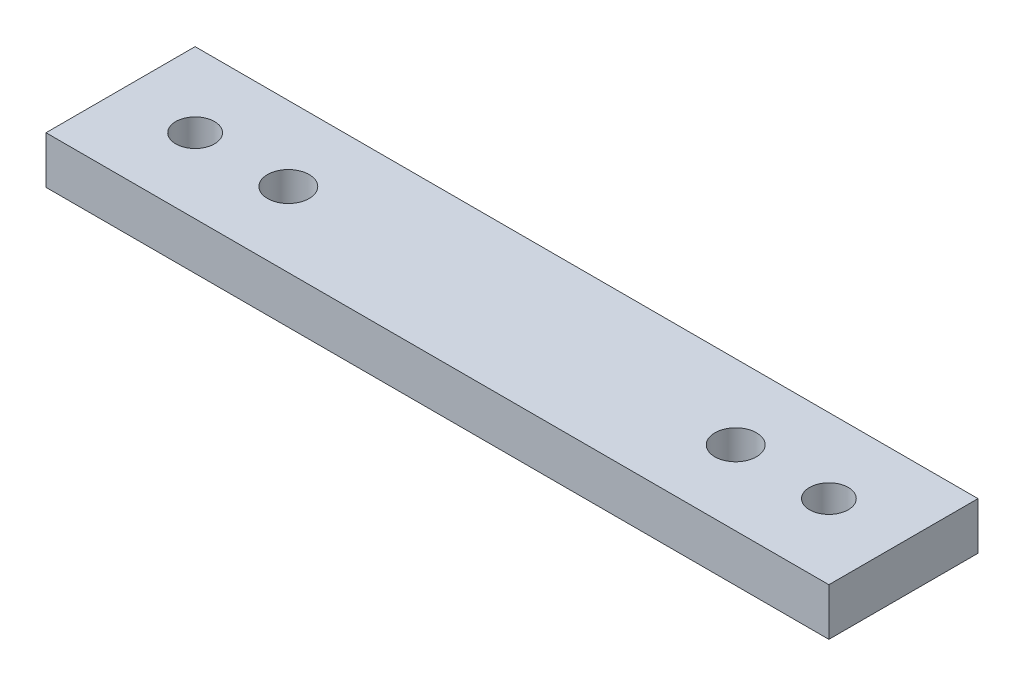
ISO-10303-21;
HEADER;
FILE_DESCRIPTION(('STEP AP214'),'2;1');
FILE_NAME('part.step','',(''),(''),'','','');
FILE_SCHEMA(('AUTOMOTIVE_DESIGN { 1 0 10303 214 1 1 1 1 }'));
ENDSEC;
DATA;
#1=APPLICATION_CONTEXT('core data for automotive mechanical design processes');
#2=APPLICATION_PROTOCOL_DEFINITION('international standard','automotive_design',2000,#1);
#3=PRODUCT_CONTEXT('',#1,'mechanical');
#4=PRODUCT('Part','Part','',(#3));
#5=PRODUCT_RELATED_PRODUCT_CATEGORY('part','',(#4));
#6=PRODUCT_DEFINITION_FORMATION('','',#4);
#7=PRODUCT_DEFINITION_CONTEXT('part definition',#1,'design');
#8=PRODUCT_DEFINITION('design','',#6,#7);
#9=PRODUCT_DEFINITION_SHAPE('','',#8);
#10=(LENGTH_UNIT() NAMED_UNIT(*) SI_UNIT(.MILLI.,.METRE.));
#11=(NAMED_UNIT(*) PLANE_ANGLE_UNIT() SI_UNIT($,.RADIAN.));
#12=(NAMED_UNIT(*) SI_UNIT($,.STERADIAN.) SOLID_ANGLE_UNIT());
#13=UNCERTAINTY_MEASURE_WITH_UNIT(LENGTH_MEASURE(1.E-05),#10,'distance_accuracy_value','');
#14=(GEOMETRIC_REPRESENTATION_CONTEXT(3) GLOBAL_UNCERTAINTY_ASSIGNED_CONTEXT((#13)) GLOBAL_UNIT_ASSIGNED_CONTEXT((#10,
#11,#12)) REPRESENTATION_CONTEXT('',''));
#15=CARTESIAN_POINT('',(0.,0.,0.));
#16=DIRECTION('',(0.,0.,1.));
#17=DIRECTION('',(1.,0.,0.));
#18=AXIS2_PLACEMENT_3D('',#15,#16,#17);
#19=CARTESIAN_POINT('',(52.5,-3.175,-10.));
#20=DIRECTION('',(1.,0.,0.));
#21=DIRECTION('',(0.,0.,-1.));
#22=AXIS2_PLACEMENT_3D('',#19,#20,#21);
#23=PLANE('',#22);
#24=DIRECTION('',(0.,1.,0.));
#25=VECTOR('',#24,1.);
#26=CARTESIAN_POINT('',(52.5,-3.175,-10.));
#27=LINE('',#26,#25);
#28=CARTESIAN_POINT('',(52.5,-3.175,-10.));
#29=VERTEX_POINT('',#28);
#30=CARTESIAN_POINT('',(52.5,3.175,-10.));
#31=VERTEX_POINT('',#30);
#32=EDGE_CURVE('E35',#29,#31,#27,.T.);
#33=ORIENTED_EDGE('',*,*,#32,.T.);
#34=DIRECTION('',(0.,0.,-1.));
#35=VECTOR('',#34,1.);
#36=CARTESIAN_POINT('',(52.5,3.175,-10.));
#37=LINE('',#36,#35);
#38=CARTESIAN_POINT('',(52.5,3.175,10.));
#39=VERTEX_POINT('',#38);
#40=EDGE_CURVE('E72',#39,#31,#37,.T.);
#41=ORIENTED_EDGE('',*,*,#40,.F.);
#42=DIRECTION('',(0.,1.,0.));
#43=VECTOR('',#42,1.);
#44=CARTESIAN_POINT('',(52.5,-3.175,10.));
#45=LINE('',#44,#43);
#46=CARTESIAN_POINT('',(52.5,-3.175,10.));
#47=VERTEX_POINT('',#46);
#48=EDGE_CURVE('E11',#47,#39,#45,.T.);
#49=ORIENTED_EDGE('',*,*,#48,.F.);
#50=DIRECTION('',(0.,0.,-1.));
#51=VECTOR('',#50,1.);
#52=CARTESIAN_POINT('',(52.5,-3.175,-10.));
#53=LINE('',#52,#51);
#54=EDGE_CURVE('E73',#47,#29,#53,.T.);
#55=ORIENTED_EDGE('',*,*,#54,.T.);
#56=EDGE_LOOP('',(#33,#41,#49,#55));
#57=FACE_BOUND('',#56,.T.);
#58=ADVANCED_FACE('F32',(#57),#23,.T.);
#59=CARTESIAN_POINT('',(-52.5,-3.175,10.));
#60=DIRECTION('',(0.,0.,1.));
#61=DIRECTION('',(1.,0.,0.));
#62=AXIS2_PLACEMENT_3D('',#59,#60,#61);
#63=PLANE('',#62);
#64=ORIENTED_EDGE('',*,*,#48,.T.);
#65=DIRECTION('',(1.,0.,0.));
#66=VECTOR('',#65,1.);
#67=CARTESIAN_POINT('',(-52.5,3.175,10.));
#68=LINE('',#67,#66);
#69=CARTESIAN_POINT('',(-52.5,3.175,10.));
#70=VERTEX_POINT('',#69);
#71=EDGE_CURVE('E90',#70,#39,#68,.T.);
#72=ORIENTED_EDGE('',*,*,#71,.F.);
#73=DIRECTION('',(0.,1.,0.));
#74=VECTOR('',#73,1.);
#75=CARTESIAN_POINT('',(-52.5,-3.175,10.));
#76=LINE('',#75,#74);
#77=CARTESIAN_POINT('',(-52.5,-3.175,10.));
#78=VERTEX_POINT('',#77);
#79=EDGE_CURVE('E40',#78,#70,#76,.T.);
#80=ORIENTED_EDGE('',*,*,#79,.F.);
#81=DIRECTION('',(1.,0.,0.));
#82=VECTOR('',#81,1.);
#83=CARTESIAN_POINT('',(-52.5,-3.175,10.));
#84=LINE('',#83,#82);
#85=EDGE_CURVE('E78',#78,#47,#84,.T.);
#86=ORIENTED_EDGE('',*,*,#85,.T.);
#87=EDGE_LOOP('',(#64,#72,#80,#86));
#88=FACE_BOUND('',#87,.T.);
#89=ADVANCED_FACE('F122',(#88),#63,.T.);
#90=CARTESIAN_POINT('',(-52.5,-3.175,-10.));
#91=DIRECTION('',(-1.,0.,0.));
#92=DIRECTION('',(0.,0.,1.));
#93=AXIS2_PLACEMENT_3D('',#90,#91,#92);
#94=PLANE('',#93);
#95=ORIENTED_EDGE('',*,*,#79,.T.);
#96=DIRECTION('',(0.,0.,1.));
#97=VECTOR('',#96,1.);
#98=CARTESIAN_POINT('',(-52.5,3.175,-10.));
#99=LINE('',#98,#97);
#100=CARTESIAN_POINT('',(-52.5,3.175,-10.));
#101=VERTEX_POINT('',#100);
#102=EDGE_CURVE('E85',#101,#70,#99,.T.);
#103=ORIENTED_EDGE('',*,*,#102,.F.);
#104=DIRECTION('',(0.,1.,0.));
#105=VECTOR('',#104,1.);
#106=CARTESIAN_POINT('',(-52.5,-3.175,-10.));
#107=LINE('',#106,#105);
#108=CARTESIAN_POINT('',(-52.5,-3.175,-10.));
#109=VERTEX_POINT('',#108);
#110=EDGE_CURVE('E77',#109,#101,#107,.T.);
#111=ORIENTED_EDGE('',*,*,#110,.F.);
#112=DIRECTION('',(0.,0.,1.));
#113=VECTOR('',#112,1.);
#114=CARTESIAN_POINT('',(-52.5,-3.175,-10.));
#115=LINE('',#114,#113);
#116=EDGE_CURVE('E115',#109,#78,#115,.T.);
#117=ORIENTED_EDGE('',*,*,#116,.T.);
#118=EDGE_LOOP('',(#95,#103,#111,#117));
#119=FACE_BOUND('',#118,.T.);
#120=ADVANCED_FACE('F119',(#119),#94,.T.);
#121=CARTESIAN_POINT('',(-52.5,-3.175,-10.));
#122=DIRECTION('',(0.,0.,-1.));
#123=DIRECTION('',(-1.,0.,0.));
#124=AXIS2_PLACEMENT_3D('',#121,#122,#123);
#125=PLANE('',#124);
#126=ORIENTED_EDGE('',*,*,#110,.T.);
#127=DIRECTION('',(-1.,0.,0.));
#128=VECTOR('',#127,1.);
#129=CARTESIAN_POINT('',(-52.5,3.175,-10.));
#130=LINE('',#129,#128);
#131=EDGE_CURVE('E80',#31,#101,#130,.T.);
#132=ORIENTED_EDGE('',*,*,#131,.F.);
#133=ORIENTED_EDGE('',*,*,#32,.F.);
#134=DIRECTION('',(-1.,0.,0.));
#135=VECTOR('',#134,1.);
#136=CARTESIAN_POINT('',(-52.5,-3.175,-10.));
#137=LINE('',#136,#135);
#138=EDGE_CURVE('E113',#29,#109,#137,.T.);
#139=ORIENTED_EDGE('',*,*,#138,.T.);
#140=EDGE_LOOP('',(#126,#132,#133,#139));
#141=FACE_BOUND('',#140,.T.);
#142=ADVANCED_FACE('F81',(#141),#125,.T.);
#143=CARTESIAN_POINT('',(0.,-3.175,0.));
#144=DIRECTION('',(0.,1.,0.));
#145=DIRECTION('',(0.,0.,1.));
#146=AXIS2_PLACEMENT_3D('',#143,#144,#145);
#147=PLANE('',#146);
#148=CARTESIAN_POINT('',(42.5,-3.175,0.));
#149=DIRECTION('',(0.,1.,0.));
#150=DIRECTION('',(0.,0.,1.));
#151=AXIS2_PLACEMENT_3D('',#148,#149,#150);
#152=CIRCLE('',#151,2.6);
#153=CARTESIAN_POINT('',(42.5,-3.175,2.6));
#154=VERTEX_POINT('',#153);
#155=EDGE_CURVE('E100',#154,#154,#152,.T.);
#156=ORIENTED_EDGE('',*,*,#155,.T.);
#157=EDGE_LOOP('',(#156));
#158=FACE_BOUND('',#157,.T.);
#159=CARTESIAN_POINT('',(-42.5,-3.175,0.));
#160=DIRECTION('',(0.,1.,0.));
#161=DIRECTION('',(0.,0.,1.));
#162=AXIS2_PLACEMENT_3D('',#159,#160,#161);
#163=CIRCLE('',#162,2.6);
#164=CARTESIAN_POINT('',(-42.5,-3.175,2.6));
#165=VERTEX_POINT('',#164);
#166=EDGE_CURVE('E103',#165,#165,#163,.T.);
#167=ORIENTED_EDGE('',*,*,#166,.T.);
#168=EDGE_LOOP('',(#167));
#169=FACE_BOUND('',#168,.T.);
#170=CARTESIAN_POINT('',(30.,-3.175,0.));
#171=DIRECTION('',(0.,1.,0.));
#172=DIRECTION('',(0.,0.,1.));
#173=AXIS2_PLACEMENT_3D('',#170,#171,#172);
#174=CIRCLE('',#173,2.794);
#175=CARTESIAN_POINT('',(30.,-3.175,2.794));
#176=VERTEX_POINT('',#175);
#177=EDGE_CURVE('E106',#176,#176,#174,.T.);
#178=ORIENTED_EDGE('',*,*,#177,.T.);
#179=EDGE_LOOP('',(#178));
#180=FACE_BOUND('',#179,.T.);
#181=CARTESIAN_POINT('',(-30.,-3.175,0.));
#182=DIRECTION('',(0.,1.,0.));
#183=DIRECTION('',(0.,0.,1.));
#184=AXIS2_PLACEMENT_3D('',#181,#182,#183);
#185=CIRCLE('',#184,2.794);
#186=CARTESIAN_POINT('',(-30.,-3.175,2.794));
#187=VERTEX_POINT('',#186);
#188=EDGE_CURVE('E109',#187,#187,#185,.T.);
#189=ORIENTED_EDGE('',*,*,#188,.T.);
#190=EDGE_LOOP('',(#189));
#191=FACE_BOUND('',#190,.T.);
#192=ORIENTED_EDGE('',*,*,#54,.F.);
#193=ORIENTED_EDGE('',*,*,#85,.F.);
#194=ORIENTED_EDGE('',*,*,#116,.F.);
#195=ORIENTED_EDGE('',*,*,#138,.F.);
#196=EDGE_LOOP('',(#192,#193,#194,#195));
#197=FACE_BOUND('',#196,.T.);
#198=ADVANCED_FACE('F124',(#158,#169,#180,#191,#197),#147,.F.);
#199=CARTESIAN_POINT('',(-30.,-3.175,0.));
#200=DIRECTION('',(0.,1.,0.));
#201=DIRECTION('',(0.,0.,1.));
#202=AXIS2_PLACEMENT_3D('',#199,#200,#201);
#203=CYLINDRICAL_SURFACE('',#202,2.794);
#204=ORIENTED_EDGE('',*,*,#188,.F.);
#205=EDGE_LOOP('',(#204));
#206=FACE_BOUND('',#205,.T.);
#207=CARTESIAN_POINT('',(-30.,3.175,0.));
#208=DIRECTION('',(0.,1.,0.));
#209=DIRECTION('',(0.,0.,1.));
#210=AXIS2_PLACEMENT_3D('',#207,#208,#209);
#211=CIRCLE('',#210,2.794);
#212=CARTESIAN_POINT('',(-30.,3.175,2.794));
#213=VERTEX_POINT('',#212);
#214=EDGE_CURVE('E91',#213,#213,#211,.T.);
#215=ORIENTED_EDGE('',*,*,#214,.T.);
#216=EDGE_LOOP('',(#215));
#217=FACE_BOUND('',#216,.T.);
#218=ADVANCED_FACE('F126',(#206,#217),#203,.F.);
#219=CARTESIAN_POINT('',(30.,-3.175,0.));
#220=DIRECTION('',(0.,1.,0.));
#221=DIRECTION('',(0.,0.,1.));
#222=AXIS2_PLACEMENT_3D('',#219,#220,#221);
#223=CYLINDRICAL_SURFACE('',#222,2.794);
#224=ORIENTED_EDGE('',*,*,#177,.F.);
#225=EDGE_LOOP('',(#224));
#226=FACE_BOUND('',#225,.T.);
#227=CARTESIAN_POINT('',(30.,3.175,0.));
#228=DIRECTION('',(0.,1.,0.));
#229=DIRECTION('',(0.,0.,1.));
#230=AXIS2_PLACEMENT_3D('',#227,#228,#229);
#231=CIRCLE('',#230,2.794);
#232=CARTESIAN_POINT('',(30.,3.175,2.794));
#233=VERTEX_POINT('',#232);
#234=EDGE_CURVE('E94',#233,#233,#231,.T.);
#235=ORIENTED_EDGE('',*,*,#234,.T.);
#236=EDGE_LOOP('',(#235));
#237=FACE_BOUND('',#236,.T.);
#238=ADVANCED_FACE('F133',(#226,#237),#223,.F.);
#239=CARTESIAN_POINT('',(-42.5,-3.175,0.));
#240=DIRECTION('',(0.,1.,0.));
#241=DIRECTION('',(0.,0.,1.));
#242=AXIS2_PLACEMENT_3D('',#239,#240,#241);
#243=CYLINDRICAL_SURFACE('',#242,2.6);
#244=ORIENTED_EDGE('',*,*,#166,.F.);
#245=EDGE_LOOP('',(#244));
#246=FACE_BOUND('',#245,.T.);
#247=CARTESIAN_POINT('',(-42.5,3.175,0.));
#248=DIRECTION('',(0.,1.,0.));
#249=DIRECTION('',(0.,0.,1.));
#250=AXIS2_PLACEMENT_3D('',#247,#248,#249);
#251=CIRCLE('',#250,2.6);
#252=CARTESIAN_POINT('',(-42.5,3.175,2.6));
#253=VERTEX_POINT('',#252);
#254=EDGE_CURVE('E207',#253,#253,#251,.T.);
#255=ORIENTED_EDGE('',*,*,#254,.T.);
#256=EDGE_LOOP('',(#255));
#257=FACE_BOUND('',#256,.T.);
#258=ADVANCED_FACE('F171',(#246,#257),#243,.F.);
#259=CARTESIAN_POINT('',(42.5,-3.175,0.));
#260=DIRECTION('',(0.,1.,0.));
#261=DIRECTION('',(0.,0.,1.));
#262=AXIS2_PLACEMENT_3D('',#259,#260,#261);
#263=CYLINDRICAL_SURFACE('',#262,2.6);
#264=ORIENTED_EDGE('',*,*,#155,.F.);
#265=EDGE_LOOP('',(#264));
#266=FACE_BOUND('',#265,.T.);
#267=CARTESIAN_POINT('',(42.5,3.175,0.));
#268=DIRECTION('',(0.,1.,0.));
#269=DIRECTION('',(0.,0.,1.));
#270=AXIS2_PLACEMENT_3D('',#267,#268,#269);
#271=CIRCLE('',#270,2.6);
#272=CARTESIAN_POINT('',(42.5,3.175,2.6));
#273=VERTEX_POINT('',#272);
#274=EDGE_CURVE('E211',#273,#273,#271,.T.);
#275=ORIENTED_EDGE('',*,*,#274,.T.);
#276=EDGE_LOOP('',(#275));
#277=FACE_BOUND('',#276,.T.);
#278=ADVANCED_FACE('F181',(#266,#277),#263,.F.);
#279=CARTESIAN_POINT('',(0.,3.175,0.));
#280=DIRECTION('',(0.,1.,0.));
#281=DIRECTION('',(0.,0.,1.));
#282=AXIS2_PLACEMENT_3D('',#279,#280,#281);
#283=PLANE('',#282);
#284=ORIENTED_EDGE('',*,*,#254,.F.);
#285=EDGE_LOOP('',(#284));
#286=FACE_BOUND('',#285,.T.);
#287=ORIENTED_EDGE('',*,*,#214,.F.);
#288=EDGE_LOOP('',(#287));
#289=FACE_BOUND('',#288,.T.);
#290=ORIENTED_EDGE('',*,*,#40,.T.);
#291=ORIENTED_EDGE('',*,*,#131,.T.);
#292=ORIENTED_EDGE('',*,*,#102,.T.);
#293=ORIENTED_EDGE('',*,*,#71,.T.);
#294=EDGE_LOOP('',(#290,#291,#292,#293));
#295=FACE_BOUND('',#294,.T.);
#296=ORIENTED_EDGE('',*,*,#234,.F.);
#297=EDGE_LOOP('',(#296));
#298=FACE_BOUND('',#297,.T.);
#299=ORIENTED_EDGE('',*,*,#274,.F.);
#300=EDGE_LOOP('',(#299));
#301=FACE_BOUND('',#300,.T.);
#302=ADVANCED_FACE('F88',(#286,#289,#295,#298,#301),#283,.T.);
#303=CLOSED_SHELL('',(#58,#89,#120,#142,#198,#218,#238,#258,#278,#302));
#304=MANIFOLD_SOLID_BREP('B2',#303);
#305=ADVANCED_BREP_SHAPE_REPRESENTATION('',(#18,#304),#14);
#306=SHAPE_DEFINITION_REPRESENTATION(#9,#305);
ENDSEC;
END-ISO-10303-21;
